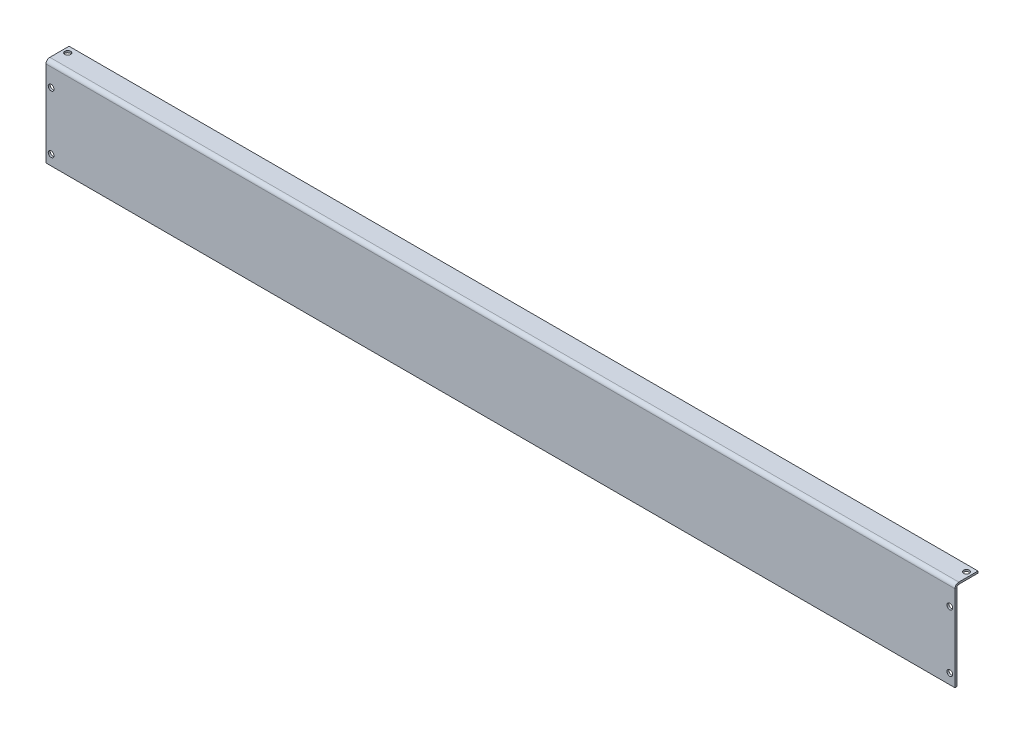
ISO-10303-21;
HEADER;
FILE_DESCRIPTION(('STEP AP214'),'2;1');
FILE_NAME('part.step','',(''),(''),'','','');
FILE_SCHEMA(('AUTOMOTIVE_DESIGN { 1 0 10303 214 1 1 1 1 }'));
ENDSEC;
DATA;
#1=APPLICATION_CONTEXT('core data for automotive mechanical design processes');
#2=APPLICATION_PROTOCOL_DEFINITION('international standard','automotive_design',2000,#1);
#3=PRODUCT_CONTEXT('',#1,'mechanical');
#4=PRODUCT('Part','Part','',(#3));
#5=PRODUCT_RELATED_PRODUCT_CATEGORY('part','',(#4));
#6=PRODUCT_DEFINITION_FORMATION('','',#4);
#7=PRODUCT_DEFINITION_CONTEXT('part definition',#1,'design');
#8=PRODUCT_DEFINITION('design','',#6,#7);
#9=PRODUCT_DEFINITION_SHAPE('','',#8);
#10=(LENGTH_UNIT() NAMED_UNIT(*) SI_UNIT(.MILLI.,.METRE.));
#11=(NAMED_UNIT(*) PLANE_ANGLE_UNIT() SI_UNIT($,.RADIAN.));
#12=(NAMED_UNIT(*) SI_UNIT($,.STERADIAN.) SOLID_ANGLE_UNIT());
#13=UNCERTAINTY_MEASURE_WITH_UNIT(LENGTH_MEASURE(1.E-05),#10,'distance_accuracy_value','');
#14=(GEOMETRIC_REPRESENTATION_CONTEXT(3) GLOBAL_UNCERTAINTY_ASSIGNED_CONTEXT((#13)) GLOBAL_UNIT_ASSIGNED_CONTEXT((#10,
#11,#12)) REPRESENTATION_CONTEXT('',''));
#15=CARTESIAN_POINT('',(0.,0.,0.));
#16=DIRECTION('',(0.,0.,1.));
#17=DIRECTION('',(1.,0.,0.));
#18=AXIS2_PLACEMENT_3D('',#15,#16,#17);
#19=CARTESIAN_POINT('',(355.,-35.,-1.5));
#20=DIRECTION('',(1.,0.,0.));
#21=DIRECTION('',(0.,0.,-1.));
#22=AXIS2_PLACEMENT_3D('',#19,#20,#21);
#23=PLANE('',#22);
#24=DIRECTION('',(0.,1.,0.));
#25=VECTOR('',#24,1.);
#26=CARTESIAN_POINT('',(355.,-35.,-1.5));
#27=LINE('',#26,#25);
#28=CARTESIAN_POINT('',(355.,-35.,-1.5));
#29=VERTEX_POINT('',#28);
#30=CARTESIAN_POINT('',(355.,32.,-1.5));
#31=VERTEX_POINT('',#30);
#32=EDGE_CURVE('E144',#29,#31,#27,.T.);
#33=ORIENTED_EDGE('',*,*,#32,.T.);
#34=DIRECTION('',(0.,0.,1.));
#35=VECTOR('',#34,1.);
#36=CARTESIAN_POINT('',(355.,32.,-1.5));
#37=LINE('',#36,#35);
#38=CARTESIAN_POINT('',(355.,32.,0.));
#39=VERTEX_POINT('',#38);
#40=EDGE_CURVE('E131',#31,#39,#37,.T.);
#41=ORIENTED_EDGE('',*,*,#40,.T.);
#42=DIRECTION('',(0.,1.,0.));
#43=VECTOR('',#42,1.);
#44=CARTESIAN_POINT('',(355.,-35.,0.));
#45=LINE('',#44,#43);
#46=CARTESIAN_POINT('',(355.,-35.,0.));
#47=VERTEX_POINT('',#46);
#48=EDGE_CURVE('E142',#47,#39,#45,.T.);
#49=ORIENTED_EDGE('',*,*,#48,.F.);
#50=DIRECTION('',(0.,0.,1.));
#51=VECTOR('',#50,1.);
#52=CARTESIAN_POINT('',(355.,-35.,-1.5));
#53=LINE('',#52,#51);
#54=EDGE_CURVE('E11',#29,#47,#53,.T.);
#55=ORIENTED_EDGE('',*,*,#54,.F.);
#56=EDGE_LOOP('',(#33,#41,#49,#55));
#57=FACE_BOUND('',#56,.T.);
#58=ADVANCED_FACE('F17',(#57),#23,.T.);
#59=CARTESIAN_POINT('',(0.,0.,-1.5));
#60=DIRECTION('',(0.,0.,-1.));
#61=DIRECTION('',(-1.,0.,0.));
#62=AXIS2_PLACEMENT_3D('',#59,#60,#61);
#63=PLANE('',#62);
#64=CARTESIAN_POINT('',(351.,-27.,-1.5));
#65=DIRECTION('',(0.,0.,-1.));
#66=DIRECTION('',(-1.,0.,0.));
#67=AXIS2_PLACEMENT_3D('',#64,#65,#66);
#68=CIRCLE('',#67,2.24999999999997);
#69=CARTESIAN_POINT('',(348.75,-27.,-1.5));
#70=VERTEX_POINT('',#69);
#71=EDGE_CURVE('E380',#70,#70,#68,.T.);
#72=ORIENTED_EDGE('',*,*,#71,.F.);
#73=EDGE_LOOP('',(#72));
#74=FACE_BOUND('',#73,.T.);
#75=CARTESIAN_POINT('',(351.,18.,-1.5));
#76=DIRECTION('',(0.,0.,-1.));
#77=DIRECTION('',(-1.,0.,0.));
#78=AXIS2_PLACEMENT_3D('',#75,#76,#77);
#79=CIRCLE('',#78,2.24999999999997);
#80=CARTESIAN_POINT('',(348.75,18.,-1.5));
#81=VERTEX_POINT('',#80);
#82=EDGE_CURVE('E386',#81,#81,#79,.T.);
#83=ORIENTED_EDGE('',*,*,#82,.F.);
#84=EDGE_LOOP('',(#83));
#85=FACE_BOUND('',#84,.T.);
#86=CARTESIAN_POINT('',(-351.,-27.,-1.5));
#87=DIRECTION('',(0.,0.,-1.));
#88=DIRECTION('',(-1.,0.,0.));
#89=AXIS2_PLACEMENT_3D('',#86,#87,#88);
#90=CIRCLE('',#89,2.24999999999997);
#91=CARTESIAN_POINT('',(-353.25,-27.,-1.5));
#92=VERTEX_POINT('',#91);
#93=EDGE_CURVE('E392',#92,#92,#90,.T.);
#94=ORIENTED_EDGE('',*,*,#93,.F.);
#95=EDGE_LOOP('',(#94));
#96=FACE_BOUND('',#95,.T.);
#97=CARTESIAN_POINT('',(-351.,18.,-1.5));
#98=DIRECTION('',(0.,0.,-1.));
#99=DIRECTION('',(-1.,0.,0.));
#100=AXIS2_PLACEMENT_3D('',#97,#98,#99);
#101=CIRCLE('',#100,2.24999999999997);
#102=CARTESIAN_POINT('',(-353.25,18.,-1.5));
#103=VERTEX_POINT('',#102);
#104=EDGE_CURVE('E124',#103,#103,#101,.T.);
#105=ORIENTED_EDGE('',*,*,#104,.F.);
#106=EDGE_LOOP('',(#105));
#107=FACE_BOUND('',#106,.T.);
#108=DIRECTION('',(0.,-1.,0.));
#109=VECTOR('',#108,1.);
#110=CARTESIAN_POINT('',(-355.,-35.,-1.5));
#111=LINE('',#110,#109);
#112=CARTESIAN_POINT('',(-355.,32.,-1.5));
#113=VERTEX_POINT('',#112);
#114=CARTESIAN_POINT('',(-355.,-35.,-1.5));
#115=VERTEX_POINT('',#114);
#116=EDGE_CURVE('E146',#113,#115,#111,.T.);
#117=ORIENTED_EDGE('',*,*,#116,.F.);
#118=DIRECTION('',(1.,0.,0.));
#119=VECTOR('',#118,1.);
#120=CARTESIAN_POINT('',(355.,32.,-1.5));
#121=LINE('',#120,#119);
#122=EDGE_CURVE('E38',#31,#113,#121,.F.);
#123=ORIENTED_EDGE('',*,*,#122,.F.);
#124=ORIENTED_EDGE('',*,*,#32,.F.);
#125=DIRECTION('',(1.,0.,0.));
#126=VECTOR('',#125,1.);
#127=CARTESIAN_POINT('',(-355.,-35.,-1.5));
#128=LINE('',#127,#126);
#129=EDGE_CURVE('E149',#115,#29,#128,.T.);
#130=ORIENTED_EDGE('',*,*,#129,.F.);
#131=EDGE_LOOP('',(#117,#123,#124,#130));
#132=FACE_BOUND('',#131,.T.);
#133=ADVANCED_FACE('F198',(#74,#85,#96,#107,#132),#63,.T.);
#134=CARTESIAN_POINT('',(0.,0.,0.));
#135=DIRECTION('',(0.,0.,-1.));
#136=DIRECTION('',(-1.,0.,0.));
#137=AXIS2_PLACEMENT_3D('',#134,#135,#136);
#138=PLANE('',#137);
#139=CARTESIAN_POINT('',(351.,-27.,0.));
#140=DIRECTION('',(0.,0.,1.));
#141=DIRECTION('',(1.,0.,0.));
#142=AXIS2_PLACEMENT_3D('',#139,#140,#141);
#143=CIRCLE('',#142,2.24999999999997);
#144=CARTESIAN_POINT('',(353.25,-27.,0.));
#145=VERTEX_POINT('',#144);
#146=EDGE_CURVE('E377',#145,#145,#143,.T.);
#147=ORIENTED_EDGE('',*,*,#146,.F.);
#148=EDGE_LOOP('',(#147));
#149=FACE_BOUND('',#148,.T.);
#150=CARTESIAN_POINT('',(351.,18.,0.));
#151=DIRECTION('',(0.,0.,1.));
#152=DIRECTION('',(1.,0.,0.));
#153=AXIS2_PLACEMENT_3D('',#150,#151,#152);
#154=CIRCLE('',#153,2.24999999999997);
#155=CARTESIAN_POINT('',(353.25,18.,0.));
#156=VERTEX_POINT('',#155);
#157=EDGE_CURVE('E383',#156,#156,#154,.T.);
#158=ORIENTED_EDGE('',*,*,#157,.F.);
#159=EDGE_LOOP('',(#158));
#160=FACE_BOUND('',#159,.T.);
#161=CARTESIAN_POINT('',(-351.,-27.,0.));
#162=DIRECTION('',(0.,0.,1.));
#163=DIRECTION('',(1.,0.,0.));
#164=AXIS2_PLACEMENT_3D('',#161,#162,#163);
#165=CIRCLE('',#164,2.24999999999997);
#166=CARTESIAN_POINT('',(-348.75,-27.,0.));
#167=VERTEX_POINT('',#166);
#168=EDGE_CURVE('E389',#167,#167,#165,.T.);
#169=ORIENTED_EDGE('',*,*,#168,.F.);
#170=EDGE_LOOP('',(#169));
#171=FACE_BOUND('',#170,.T.);
#172=CARTESIAN_POINT('',(-351.,18.,0.));
#173=DIRECTION('',(0.,0.,1.));
#174=DIRECTION('',(1.,0.,0.));
#175=AXIS2_PLACEMENT_3D('',#172,#173,#174);
#176=CIRCLE('',#175,2.24999999999997);
#177=CARTESIAN_POINT('',(-348.75,18.,0.));
#178=VERTEX_POINT('',#177);
#179=EDGE_CURVE('E395',#178,#178,#176,.T.);
#180=ORIENTED_EDGE('',*,*,#179,.F.);
#181=EDGE_LOOP('',(#180));
#182=FACE_BOUND('',#181,.T.);
#183=DIRECTION('',(1.,0.,0.));
#184=VECTOR('',#183,1.);
#185=CARTESIAN_POINT('',(355.,32.,0.));
#186=LINE('',#185,#184);
#187=CARTESIAN_POINT('',(-355.,32.,0.));
#188=VERTEX_POINT('',#187);
#189=EDGE_CURVE('E125',#39,#188,#186,.F.);
#190=ORIENTED_EDGE('',*,*,#189,.T.);
#191=DIRECTION('',(0.,-1.,0.));
#192=VECTOR('',#191,1.);
#193=CARTESIAN_POINT('',(-355.,-35.,0.));
#194=LINE('',#193,#192);
#195=CARTESIAN_POINT('',(-355.,-35.,0.));
#196=VERTEX_POINT('',#195);
#197=EDGE_CURVE('E154',#188,#196,#194,.T.);
#198=ORIENTED_EDGE('',*,*,#197,.T.);
#199=DIRECTION('',(1.,0.,0.));
#200=VECTOR('',#199,1.);
#201=CARTESIAN_POINT('',(-355.,-35.,0.));
#202=LINE('',#201,#200);
#203=EDGE_CURVE('E147',#196,#47,#202,.T.);
#204=ORIENTED_EDGE('',*,*,#203,.T.);
#205=ORIENTED_EDGE('',*,*,#48,.T.);
#206=EDGE_LOOP('',(#190,#198,#204,#205));
#207=FACE_BOUND('',#206,.T.);
#208=ADVANCED_FACE('F159',(#149,#160,#171,#182,#207),#138,.F.);
#209=CARTESIAN_POINT('',(-355.,-35.,-1.5));
#210=DIRECTION('',(0.,-1.,0.));
#211=DIRECTION('',(0.,0.,-1.));
#212=AXIS2_PLACEMENT_3D('',#209,#210,#211);
#213=PLANE('',#212);
#214=ORIENTED_EDGE('',*,*,#203,.F.);
#215=DIRECTION('',(0.,0.,1.));
#216=VECTOR('',#215,1.);
#217=CARTESIAN_POINT('',(-355.,-35.,-1.5));
#218=LINE('',#217,#216);
#219=EDGE_CURVE('E20',#115,#196,#218,.T.);
#220=ORIENTED_EDGE('',*,*,#219,.F.);
#221=ORIENTED_EDGE('',*,*,#129,.T.);
#222=ORIENTED_EDGE('',*,*,#54,.T.);
#223=EDGE_LOOP('',(#214,#220,#221,#222));
#224=FACE_BOUND('',#223,.T.);
#225=ADVANCED_FACE('F165',(#224),#213,.T.);
#226=CARTESIAN_POINT('',(-355.,-35.,-1.5));
#227=DIRECTION('',(-1.,0.,0.));
#228=DIRECTION('',(0.,0.,1.));
#229=AXIS2_PLACEMENT_3D('',#226,#227,#228);
#230=PLANE('',#229);
#231=DIRECTION('',(0.,0.,1.));
#232=VECTOR('',#231,1.);
#233=CARTESIAN_POINT('',(-355.,32.,-1.5));
#234=LINE('',#233,#232);
#235=EDGE_CURVE('E31',#113,#188,#234,.T.);
#236=ORIENTED_EDGE('',*,*,#235,.F.);
#237=ORIENTED_EDGE('',*,*,#116,.T.);
#238=ORIENTED_EDGE('',*,*,#219,.T.);
#239=ORIENTED_EDGE('',*,*,#197,.F.);
#240=EDGE_LOOP('',(#236,#237,#238,#239));
#241=FACE_BOUND('',#240,.T.);
#242=ADVANCED_FACE('F188',(#241),#230,.T.);
#243=CARTESIAN_POINT('',(-355.,32.,-3.));
#244=DIRECTION('',(-1.,0.,0.));
#245=DIRECTION('',(0.,0.,1.));
#246=AXIS2_PLACEMENT_3D('',#243,#244,#245);
#247=PLANE('',#246);
#248=DIRECTION('',(0.,-1.,0.));
#249=VECTOR('',#248,1.);
#250=CARTESIAN_POINT('',(-355.,35.,-3.));
#251=LINE('',#250,#249);
#252=CARTESIAN_POINT('',(-355.,33.5,-3.));
#253=VERTEX_POINT('',#252);
#254=CARTESIAN_POINT('',(-355.,35.,-3.));
#255=VERTEX_POINT('',#254);
#256=EDGE_CURVE('E106',#253,#255,#251,.F.);
#257=ORIENTED_EDGE('',*,*,#256,.F.);
#258=CARTESIAN_POINT('',(-355.,32.,-3.));
#259=DIRECTION('',(1.,0.,0.));
#260=DIRECTION('',(0.,0.,-1.));
#261=AXIS2_PLACEMENT_3D('',#258,#259,#260);
#262=CIRCLE('',#261,1.5);
#263=EDGE_CURVE('E134',#113,#253,#262,.F.);
#264=ORIENTED_EDGE('',*,*,#263,.F.);
#265=ORIENTED_EDGE('',*,*,#235,.T.);
#266=CARTESIAN_POINT('',(-355.,32.,-3.));
#267=DIRECTION('',(1.,0.,0.));
#268=DIRECTION('',(0.,0.,-1.));
#269=AXIS2_PLACEMENT_3D('',#266,#267,#268);
#270=CIRCLE('',#269,3.);
#271=EDGE_CURVE('E127',#188,#255,#270,.F.);
#272=ORIENTED_EDGE('',*,*,#271,.T.);
#273=EDGE_LOOP('',(#257,#264,#265,#272));
#274=FACE_BOUND('',#273,.T.);
#275=ADVANCED_FACE('F186',(#274),#247,.T.);
#276=CARTESIAN_POINT('',(355.,32.,-3.));
#277=DIRECTION('',(-1.,0.,0.));
#278=DIRECTION('',(0.,0.,1.));
#279=AXIS2_PLACEMENT_3D('',#276,#277,#278);
#280=PLANE('',#279);
#281=CARTESIAN_POINT('',(355.,32.,-3.));
#282=DIRECTION('',(1.,0.,0.));
#283=DIRECTION('',(0.,0.,-1.));
#284=AXIS2_PLACEMENT_3D('',#281,#282,#283);
#285=CIRCLE('',#284,1.5);
#286=CARTESIAN_POINT('',(355.,33.5,-3.));
#287=VERTEX_POINT('',#286);
#288=EDGE_CURVE('E138',#287,#31,#285,.T.);
#289=ORIENTED_EDGE('',*,*,#288,.F.);
#290=DIRECTION('',(0.,-1.,0.));
#291=VECTOR('',#290,1.);
#292=CARTESIAN_POINT('',(355.,33.5,-3.));
#293=LINE('',#292,#291);
#294=CARTESIAN_POINT('',(355.,35.,-3.));
#295=VERTEX_POINT('',#294);
#296=EDGE_CURVE('E118',#287,#295,#293,.F.);
#297=ORIENTED_EDGE('',*,*,#296,.T.);
#298=CARTESIAN_POINT('',(355.,32.,-3.));
#299=DIRECTION('',(1.,0.,0.));
#300=DIRECTION('',(0.,0.,-1.));
#301=AXIS2_PLACEMENT_3D('',#298,#299,#300);
#302=CIRCLE('',#301,3.);
#303=EDGE_CURVE('E128',#295,#39,#302,.T.);
#304=ORIENTED_EDGE('',*,*,#303,.T.);
#305=ORIENTED_EDGE('',*,*,#40,.F.);
#306=EDGE_LOOP('',(#289,#297,#304,#305));
#307=FACE_BOUND('',#306,.T.);
#308=ADVANCED_FACE('F171',(#307),#280,.F.);
#309=CARTESIAN_POINT('',(355.,32.,-3.));
#310=DIRECTION('',(1.,0.,0.));
#311=DIRECTION('',(0.,1.,0.));
#312=AXIS2_PLACEMENT_3D('',#309,#310,#311);
#313=CYLINDRICAL_SURFACE('',#312,3.);
#314=ORIENTED_EDGE('',*,*,#189,.F.);
#315=ORIENTED_EDGE('',*,*,#303,.F.);
#316=DIRECTION('',(1.,0.,0.));
#317=VECTOR('',#316,1.);
#318=CARTESIAN_POINT('',(-355.,35.,-3.));
#319=LINE('',#318,#317);
#320=EDGE_CURVE('E116',#295,#255,#319,.F.);
#321=ORIENTED_EDGE('',*,*,#320,.T.);
#322=ORIENTED_EDGE('',*,*,#271,.F.);
#323=EDGE_LOOP('',(#314,#315,#321,#322));
#324=FACE_BOUND('',#323,.T.);
#325=ADVANCED_FACE('F184',(#324),#313,.T.);
#326=CARTESIAN_POINT('',(355.,32.,-3.));
#327=DIRECTION('',(1.,0.,0.));
#328=DIRECTION('',(0.,1.,0.));
#329=AXIS2_PLACEMENT_3D('',#326,#327,#328);
#330=CYLINDRICAL_SURFACE('',#329,1.5);
#331=ORIENTED_EDGE('',*,*,#122,.T.);
#332=ORIENTED_EDGE('',*,*,#263,.T.);
#333=DIRECTION('',(1.,0.,0.));
#334=VECTOR('',#333,1.);
#335=CARTESIAN_POINT('',(-355.,33.5,-3.));
#336=LINE('',#335,#334);
#337=EDGE_CURVE('E121',#253,#287,#336,.T.);
#338=ORIENTED_EDGE('',*,*,#337,.T.);
#339=ORIENTED_EDGE('',*,*,#288,.T.);
#340=EDGE_LOOP('',(#331,#332,#338,#339));
#341=FACE_BOUND('',#340,.T.);
#342=ADVANCED_FACE('F174',(#341),#330,.F.);
#343=CARTESIAN_POINT('',(355.,35.,-18.));
#344=DIRECTION('',(-1.,0.,0.));
#345=DIRECTION('',(0.,0.,1.));
#346=AXIS2_PLACEMENT_3D('',#343,#344,#345);
#347=PLANE('',#346);
#348=ORIENTED_EDGE('',*,*,#296,.F.);
#349=DIRECTION('',(0.,0.,1.));
#350=VECTOR('',#349,1.);
#351=CARTESIAN_POINT('',(355.,33.5,-18.));
#352=LINE('',#351,#350);
#353=CARTESIAN_POINT('',(355.,33.5,-18.));
#354=VERTEX_POINT('',#353);
#355=EDGE_CURVE('E114',#287,#354,#352,.F.);
#356=ORIENTED_EDGE('',*,*,#355,.T.);
#357=DIRECTION('',(0.,-1.,0.));
#358=VECTOR('',#357,1.);
#359=CARTESIAN_POINT('',(355.,35.,-18.));
#360=LINE('',#359,#358);
#361=CARTESIAN_POINT('',(355.,35.,-18.));
#362=VERTEX_POINT('',#361);
#363=EDGE_CURVE('E102',#362,#354,#360,.T.);
#364=ORIENTED_EDGE('',*,*,#363,.F.);
#365=DIRECTION('',(0.,0.,-1.));
#366=VECTOR('',#365,1.);
#367=CARTESIAN_POINT('',(355.,35.,9.67763478503045E-12));
#368=LINE('',#367,#366);
#369=EDGE_CURVE('E89',#295,#362,#368,.T.);
#370=ORIENTED_EDGE('',*,*,#369,.F.);
#371=EDGE_LOOP('',(#348,#356,#364,#370));
#372=FACE_BOUND('',#371,.T.);
#373=ADVANCED_FACE('F181',(#372),#347,.F.);
#374=CARTESIAN_POINT('',(-355.,35.,-1.5));
#375=DIRECTION('',(1.,0.,0.));
#376=DIRECTION('',(0.,0.,-1.));
#377=AXIS2_PLACEMENT_3D('',#374,#375,#376);
#378=PLANE('',#377);
#379=ORIENTED_EDGE('',*,*,#256,.T.);
#380=DIRECTION('',(0.,0.,1.));
#381=VECTOR('',#380,1.);
#382=CARTESIAN_POINT('',(-355.,35.,-9.43165848730557E-12));
#383=LINE('',#382,#381);
#384=CARTESIAN_POINT('',(-355.,35.,-18.));
#385=VERTEX_POINT('',#384);
#386=EDGE_CURVE('E87',#385,#255,#383,.T.);
#387=ORIENTED_EDGE('',*,*,#386,.F.);
#388=DIRECTION('',(0.,-1.,0.));
#389=VECTOR('',#388,1.);
#390=CARTESIAN_POINT('',(-355.,35.,-18.));
#391=LINE('',#390,#389);
#392=CARTESIAN_POINT('',(-355.,33.5,-18.));
#393=VERTEX_POINT('',#392);
#394=EDGE_CURVE('E95',#385,#393,#391,.T.);
#395=ORIENTED_EDGE('',*,*,#394,.T.);
#396=DIRECTION('',(0.,0.,-1.));
#397=VECTOR('',#396,1.);
#398=CARTESIAN_POINT('',(-355.,33.5,-1.5));
#399=LINE('',#398,#397);
#400=EDGE_CURVE('E111',#393,#253,#399,.F.);
#401=ORIENTED_EDGE('',*,*,#400,.T.);
#402=EDGE_LOOP('',(#379,#387,#395,#401));
#403=FACE_BOUND('',#402,.T.);
#404=ADVANCED_FACE('F105',(#403),#378,.F.);
#405=CARTESIAN_POINT('',(0.,35.,1.22988148862448E-13));
#406=DIRECTION('',(0.,-1.,0.));
#407=DIRECTION('',(0.,0.,-1.));
#408=AXIS2_PLACEMENT_3D('',#405,#406,#407);
#409=PLANE('',#408);
#410=CARTESIAN_POINT('',(-351.,35.,-13.));
#411=DIRECTION('',(0.,1.,0.));
#412=DIRECTION('',(0.,0.,1.));
#413=AXIS2_PLACEMENT_3D('',#410,#411,#412);
#414=CIRCLE('',#413,2.24999999999997);
#415=CARTESIAN_POINT('',(-351.,35.,-10.75));
#416=VERTEX_POINT('',#415);
#417=EDGE_CURVE('E367',#416,#416,#414,.T.);
#418=ORIENTED_EDGE('',*,*,#417,.F.);
#419=EDGE_LOOP('',(#418));
#420=FACE_BOUND('',#419,.T.);
#421=CARTESIAN_POINT('',(351.,35.,-13.));
#422=DIRECTION('',(0.,1.,0.));
#423=DIRECTION('',(0.,0.,1.));
#424=AXIS2_PLACEMENT_3D('',#421,#422,#423);
#425=CIRCLE('',#424,2.24999999999997);
#426=CARTESIAN_POINT('',(351.,35.,-10.75));
#427=VERTEX_POINT('',#426);
#428=EDGE_CURVE('E369',#427,#427,#425,.T.);
#429=ORIENTED_EDGE('',*,*,#428,.F.);
#430=EDGE_LOOP('',(#429));
#431=FACE_BOUND('',#430,.T.);
#432=ORIENTED_EDGE('',*,*,#320,.F.);
#433=ORIENTED_EDGE('',*,*,#369,.T.);
#434=DIRECTION('',(-1.,0.,0.));
#435=VECTOR('',#434,1.);
#436=CARTESIAN_POINT('',(0.,35.,-18.));
#437=LINE('',#436,#435);
#438=EDGE_CURVE('E82',#362,#385,#437,.T.);
#439=ORIENTED_EDGE('',*,*,#438,.T.);
#440=ORIENTED_EDGE('',*,*,#386,.T.);
#441=EDGE_LOOP('',(#432,#433,#439,#440));
#442=FACE_BOUND('',#441,.T.);
#443=ADVANCED_FACE('F85',(#420,#431,#442),#409,.F.);
#444=CARTESIAN_POINT('',(0.,33.5,1.17750926854183E-13));
#445=DIRECTION('',(0.,-1.,0.));
#446=DIRECTION('',(0.,0.,-1.));
#447=AXIS2_PLACEMENT_3D('',#444,#445,#446);
#448=PLANE('',#447);
#449=CARTESIAN_POINT('',(-351.,33.5,-13.));
#450=DIRECTION('',(0.,-1.,0.));
#451=DIRECTION('',(0.,0.,-1.));
#452=AXIS2_PLACEMENT_3D('',#449,#450,#451);
#453=CIRCLE('',#452,2.24999999999997);
#454=CARTESIAN_POINT('',(-351.,33.5,-15.25));
#455=VERTEX_POINT('',#454);
#456=EDGE_CURVE('E364',#455,#455,#453,.T.);
#457=ORIENTED_EDGE('',*,*,#456,.F.);
#458=EDGE_LOOP('',(#457));
#459=FACE_BOUND('',#458,.T.);
#460=CARTESIAN_POINT('',(351.,33.5,-13.));
#461=DIRECTION('',(0.,-1.,0.));
#462=DIRECTION('',(0.,0.,-1.));
#463=AXIS2_PLACEMENT_3D('',#460,#461,#462);
#464=CIRCLE('',#463,2.24999999999997);
#465=CARTESIAN_POINT('',(351.,33.5,-15.25));
#466=VERTEX_POINT('',#465);
#467=EDGE_CURVE('E374',#466,#466,#464,.T.);
#468=ORIENTED_EDGE('',*,*,#467,.F.);
#469=EDGE_LOOP('',(#468));
#470=FACE_BOUND('',#469,.T.);
#471=ORIENTED_EDGE('',*,*,#355,.F.);
#472=ORIENTED_EDGE('',*,*,#337,.F.);
#473=ORIENTED_EDGE('',*,*,#400,.F.);
#474=DIRECTION('',(1.,0.,0.));
#475=VECTOR('',#474,1.);
#476=CARTESIAN_POINT('',(-355.,33.5,-18.));
#477=LINE('',#476,#475);
#478=EDGE_CURVE('E98',#354,#393,#477,.F.);
#479=ORIENTED_EDGE('',*,*,#478,.F.);
#480=EDGE_LOOP('',(#471,#472,#473,#479));
#481=FACE_BOUND('',#480,.T.);
#482=ADVANCED_FACE('F179',(#459,#470,#481),#448,.T.);
#483=CARTESIAN_POINT('',(-355.,35.,-18.));
#484=DIRECTION('',(0.,0.,1.));
#485=DIRECTION('',(0.,-1.,0.));
#486=AXIS2_PLACEMENT_3D('',#483,#484,#485);
#487=PLANE('',#486);
#488=ORIENTED_EDGE('',*,*,#478,.T.);
#489=ORIENTED_EDGE('',*,*,#394,.F.);
#490=ORIENTED_EDGE('',*,*,#438,.F.);
#491=ORIENTED_EDGE('',*,*,#363,.T.);
#492=EDGE_LOOP('',(#488,#489,#490,#491));
#493=FACE_BOUND('',#492,.T.);
#494=ADVANCED_FACE('F96',(#493),#487,.F.);
#495=CARTESIAN_POINT('',(-351.,18.,0.));
#496=DIRECTION('',(0.,0.,1.));
#497=DIRECTION('',(1.,0.,0.));
#498=AXIS2_PLACEMENT_3D('',#495,#496,#497);
#499=CYLINDRICAL_SURFACE('',#498,2.24999999999997);
#500=ORIENTED_EDGE('',*,*,#104,.T.);
#501=EDGE_LOOP('',(#500));
#502=FACE_BOUND('',#501,.T.);
#503=ORIENTED_EDGE('',*,*,#179,.T.);
#504=EDGE_LOOP('',(#503));
#505=FACE_BOUND('',#504,.T.);
#506=ADVANCED_FACE('F299',(#502,#505),#499,.F.);
#507=CARTESIAN_POINT('',(-351.,-27.,0.));
#508=DIRECTION('',(0.,0.,1.));
#509=DIRECTION('',(1.,0.,0.));
#510=AXIS2_PLACEMENT_3D('',#507,#508,#509);
#511=CYLINDRICAL_SURFACE('',#510,2.24999999999997);
#512=ORIENTED_EDGE('',*,*,#93,.T.);
#513=EDGE_LOOP('',(#512));
#514=FACE_BOUND('',#513,.T.);
#515=ORIENTED_EDGE('',*,*,#168,.T.);
#516=EDGE_LOOP('',(#515));
#517=FACE_BOUND('',#516,.T.);
#518=ADVANCED_FACE('F308',(#514,#517),#511,.F.);
#519=CARTESIAN_POINT('',(351.,18.,0.));
#520=DIRECTION('',(0.,0.,1.));
#521=DIRECTION('',(1.,0.,0.));
#522=AXIS2_PLACEMENT_3D('',#519,#520,#521);
#523=CYLINDRICAL_SURFACE('',#522,2.24999999999997);
#524=ORIENTED_EDGE('',*,*,#82,.T.);
#525=EDGE_LOOP('',(#524));
#526=FACE_BOUND('',#525,.T.);
#527=ORIENTED_EDGE('',*,*,#157,.T.);
#528=EDGE_LOOP('',(#527));
#529=FACE_BOUND('',#528,.T.);
#530=ADVANCED_FACE('F318',(#526,#529),#523,.F.);
#531=CARTESIAN_POINT('',(351.,-27.,0.));
#532=DIRECTION('',(0.,0.,1.));
#533=DIRECTION('',(1.,0.,0.));
#534=AXIS2_PLACEMENT_3D('',#531,#532,#533);
#535=CYLINDRICAL_SURFACE('',#534,2.24999999999997);
#536=ORIENTED_EDGE('',*,*,#71,.T.);
#537=EDGE_LOOP('',(#536));
#538=FACE_BOUND('',#537,.T.);
#539=ORIENTED_EDGE('',*,*,#146,.T.);
#540=EDGE_LOOP('',(#539));
#541=FACE_BOUND('',#540,.T.);
#542=ADVANCED_FACE('F328',(#538,#541),#535,.F.);
#543=CARTESIAN_POINT('',(351.,35.,-13.));
#544=DIRECTION('',(0.,1.,0.));
#545=DIRECTION('',(0.,0.,1.));
#546=AXIS2_PLACEMENT_3D('',#543,#544,#545);
#547=CYLINDRICAL_SURFACE('',#546,2.24999999999997);
#548=ORIENTED_EDGE('',*,*,#467,.T.);
#549=EDGE_LOOP('',(#548));
#550=FACE_BOUND('',#549,.T.);
#551=ORIENTED_EDGE('',*,*,#428,.T.);
#552=EDGE_LOOP('',(#551));
#553=FACE_BOUND('',#552,.T.);
#554=ADVANCED_FACE('F337',(#550,#553),#547,.F.);
#555=CARTESIAN_POINT('',(-351.,35.,-13.));
#556=DIRECTION('',(0.,1.,0.));
#557=DIRECTION('',(0.,0.,1.));
#558=AXIS2_PLACEMENT_3D('',#555,#556,#557);
#559=CYLINDRICAL_SURFACE('',#558,2.24999999999997);
#560=ORIENTED_EDGE('',*,*,#456,.T.);
#561=EDGE_LOOP('',(#560));
#562=FACE_BOUND('',#561,.T.);
#563=ORIENTED_EDGE('',*,*,#417,.T.);
#564=EDGE_LOOP('',(#563));
#565=FACE_BOUND('',#564,.T.);
#566=ADVANCED_FACE('F346',(#562,#565),#559,.F.);
#567=CLOSED_SHELL('',(#58,#133,#208,#225,#242,#275,#308,#325,#342,#373,#404,#443,#482,#494,#506,
#518,#530,#542,#554,#566));
#568=MANIFOLD_SOLID_BREP('B1',#567);
#569=ADVANCED_BREP_SHAPE_REPRESENTATION('',(#18,#568),#14);
#570=SHAPE_DEFINITION_REPRESENTATION(#9,#569);
ENDSEC;
END-ISO-10303-21;
